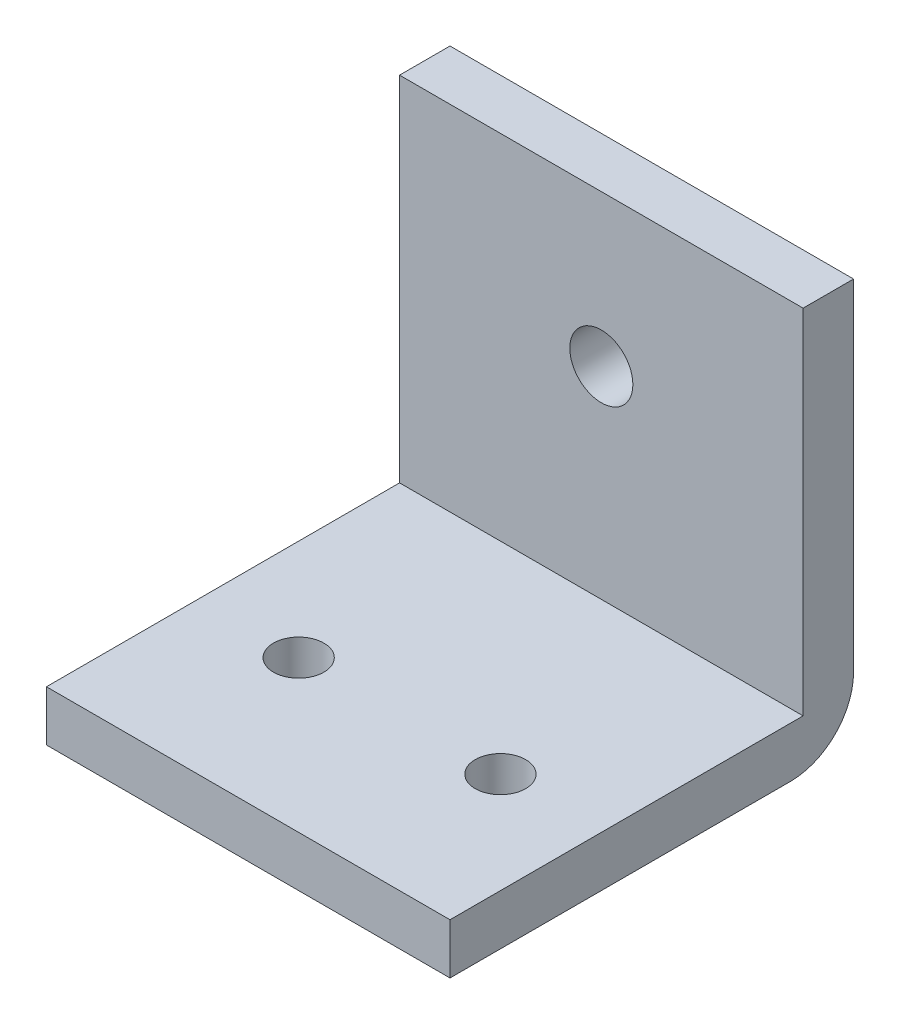
ISO-10303-21;
HEADER;
FILE_DESCRIPTION(('STEP AP214'),'2;1');
FILE_NAME('part.step','',(''),(''),'','','');
FILE_SCHEMA(('AUTOMOTIVE_DESIGN { 1 0 10303 214 1 1 1 1 }'));
ENDSEC;
DATA;
#1=APPLICATION_CONTEXT('core data for automotive mechanical design processes');
#2=APPLICATION_PROTOCOL_DEFINITION('international standard','automotive_design',2000,#1);
#3=PRODUCT_CONTEXT('',#1,'mechanical');
#4=PRODUCT('Part','Part','',(#3));
#5=PRODUCT_RELATED_PRODUCT_CATEGORY('part','',(#4));
#6=PRODUCT_DEFINITION_FORMATION('','',#4);
#7=PRODUCT_DEFINITION_CONTEXT('part definition',#1,'design');
#8=PRODUCT_DEFINITION('design','',#6,#7);
#9=PRODUCT_DEFINITION_SHAPE('','',#8);
#10=(LENGTH_UNIT() NAMED_UNIT(*) SI_UNIT(.MILLI.,.METRE.));
#11=(NAMED_UNIT(*) PLANE_ANGLE_UNIT() SI_UNIT($,.RADIAN.));
#12=(NAMED_UNIT(*) SI_UNIT($,.STERADIAN.) SOLID_ANGLE_UNIT());
#13=UNCERTAINTY_MEASURE_WITH_UNIT(LENGTH_MEASURE(1.E-05),#10,'distance_accuracy_value','');
#14=(GEOMETRIC_REPRESENTATION_CONTEXT(3) GLOBAL_UNCERTAINTY_ASSIGNED_CONTEXT((#13)) GLOBAL_UNIT_ASSIGNED_CONTEXT((#10,
#11,#12)) REPRESENTATION_CONTEXT('',''));
#15=CARTESIAN_POINT('',(0.,0.,0.));
#16=DIRECTION('',(0.,0.,1.));
#17=DIRECTION('',(1.,0.,0.));
#18=AXIS2_PLACEMENT_3D('',#15,#16,#17);
#19=CARTESIAN_POINT('',(40.,0.,5.));
#20=DIRECTION('',(-1.,0.,0.));
#21=DIRECTION('',(0.,0.,1.));
#22=AXIS2_PLACEMENT_3D('',#19,#20,#21);
#23=PLANE('',#22);
#24=DIRECTION('',(0.,0.,-1.));
#25=VECTOR('',#24,1.);
#26=CARTESIAN_POINT('',(40.,0.,40.));
#27=LINE('',#26,#25);
#28=CARTESIAN_POINT('',(40.,0.,40.));
#29=VERTEX_POINT('',#28);
#30=CARTESIAN_POINT('',(40.,0.,6.25));
#31=VERTEX_POINT('',#30);
#32=EDGE_CURVE('E126',#29,#31,#27,.T.);
#33=ORIENTED_EDGE('',*,*,#32,.T.);
#34=CARTESIAN_POINT('',(40.,6.25,6.25));
#35=DIRECTION('',(-1.,0.,0.));
#36=DIRECTION('',(0.,0.,1.));
#37=AXIS2_PLACEMENT_3D('',#34,#35,#36);
#38=CIRCLE('',#37,6.25);
#39=CARTESIAN_POINT('',(40.,6.25,0.));
#40=VERTEX_POINT('',#39);
#41=EDGE_CURVE('E58',#31,#40,#38,.F.);
#42=ORIENTED_EDGE('',*,*,#41,.T.);
#43=DIRECTION('',(0.,1.,0.));
#44=VECTOR('',#43,1.);
#45=CARTESIAN_POINT('',(40.,0.,0.));
#46=LINE('',#45,#44);
#47=CARTESIAN_POINT('',(40.,40.,0.));
#48=VERTEX_POINT('',#47);
#49=EDGE_CURVE('E103',#40,#48,#46,.T.);
#50=ORIENTED_EDGE('',*,*,#49,.T.);
#51=DIRECTION('',(0.,0.,-1.));
#52=VECTOR('',#51,1.);
#53=CARTESIAN_POINT('',(40.,40.,5.));
#54=LINE('',#53,#52);
#55=CARTESIAN_POINT('',(40.,40.,5.));
#56=VERTEX_POINT('',#55);
#57=EDGE_CURVE('E152',#56,#48,#54,.T.);
#58=ORIENTED_EDGE('',*,*,#57,.F.);
#59=DIRECTION('',(0.,1.,0.));
#60=VECTOR('',#59,1.);
#61=CARTESIAN_POINT('',(40.,0.,5.));
#62=LINE('',#61,#60);
#63=CARTESIAN_POINT('',(40.,5.,5.));
#64=VERTEX_POINT('',#63);
#65=EDGE_CURVE('E129',#64,#56,#62,.T.);
#66=ORIENTED_EDGE('',*,*,#65,.F.);
#67=DIRECTION('',(0.,0.,-1.));
#68=VECTOR('',#67,1.);
#69=CARTESIAN_POINT('',(40.,5.,40.));
#70=LINE('',#69,#68);
#71=CARTESIAN_POINT('',(40.,5.,40.));
#72=VERTEX_POINT('',#71);
#73=EDGE_CURVE('E124',#72,#64,#70,.T.);
#74=ORIENTED_EDGE('',*,*,#73,.F.);
#75=DIRECTION('',(0.,1.,0.));
#76=VECTOR('',#75,1.);
#77=CARTESIAN_POINT('',(40.,0.,40.));
#78=LINE('',#77,#76);
#79=EDGE_CURVE('E111',#29,#72,#78,.T.);
#80=ORIENTED_EDGE('',*,*,#79,.F.);
#81=EDGE_LOOP('',(#33,#42,#50,#58,#66,#74,#80));
#82=FACE_BOUND('',#81,.T.);
#83=ADVANCED_FACE('F36',(#82),#23,.F.);
#84=CARTESIAN_POINT('',(0.,40.,5.));
#85=DIRECTION('',(0.,1.,0.));
#86=DIRECTION('',(0.,0.,1.));
#87=AXIS2_PLACEMENT_3D('',#84,#85,#86);
#88=PLANE('',#87);
#89=DIRECTION('',(1.,0.,0.));
#90=VECTOR('',#89,1.);
#91=CARTESIAN_POINT('',(0.,40.,0.));
#92=LINE('',#91,#90);
#93=CARTESIAN_POINT('',(0.,40.,0.));
#94=VERTEX_POINT('',#93);
#95=EDGE_CURVE('E143',#94,#48,#92,.T.);
#96=ORIENTED_EDGE('',*,*,#95,.F.);
#97=DIRECTION('',(0.,0.,-1.));
#98=VECTOR('',#97,1.);
#99=CARTESIAN_POINT('',(0.,40.,5.));
#100=LINE('',#99,#98);
#101=CARTESIAN_POINT('',(0.,40.,5.));
#102=VERTEX_POINT('',#101);
#103=EDGE_CURVE('E141',#102,#94,#100,.T.);
#104=ORIENTED_EDGE('',*,*,#103,.F.);
#105=DIRECTION('',(1.,0.,0.));
#106=VECTOR('',#105,1.);
#107=CARTESIAN_POINT('',(0.,40.,5.));
#108=LINE('',#107,#106);
#109=EDGE_CURVE('E131',#102,#56,#108,.T.);
#110=ORIENTED_EDGE('',*,*,#109,.T.);
#111=ORIENTED_EDGE('',*,*,#57,.T.);
#112=EDGE_LOOP('',(#96,#104,#110,#111));
#113=FACE_BOUND('',#112,.T.);
#114=ADVANCED_FACE('F172',(#113),#88,.T.);
#115=CARTESIAN_POINT('',(0.,0.,5.));
#116=DIRECTION('',(-1.,0.,0.));
#117=DIRECTION('',(0.,0.,1.));
#118=AXIS2_PLACEMENT_3D('',#115,#116,#117);
#119=PLANE('',#118);
#120=DIRECTION('',(0.,1.,0.));
#121=VECTOR('',#120,1.);
#122=CARTESIAN_POINT('',(0.,0.,0.));
#123=LINE('',#122,#121);
#124=CARTESIAN_POINT('',(0.,6.25,0.));
#125=VERTEX_POINT('',#124);
#126=EDGE_CURVE('E146',#125,#94,#123,.T.);
#127=ORIENTED_EDGE('',*,*,#126,.F.);
#128=CARTESIAN_POINT('',(0.,6.25,6.25));
#129=DIRECTION('',(-1.,0.,0.));
#130=DIRECTION('',(0.,0.,1.));
#131=AXIS2_PLACEMENT_3D('',#128,#129,#130);
#132=CIRCLE('',#131,6.25);
#133=CARTESIAN_POINT('',(0.,0.,6.25));
#134=VERTEX_POINT('',#133);
#135=EDGE_CURVE('E11',#125,#134,#132,.T.);
#136=ORIENTED_EDGE('',*,*,#135,.T.);
#137=DIRECTION('',(0.,0.,-1.));
#138=VECTOR('',#137,1.);
#139=CARTESIAN_POINT('',(0.,0.,40.));
#140=LINE('',#139,#138);
#141=CARTESIAN_POINT('',(0.,0.,40.));
#142=VERTEX_POINT('',#141);
#143=EDGE_CURVE('E104',#142,#134,#140,.T.);
#144=ORIENTED_EDGE('',*,*,#143,.F.);
#145=DIRECTION('',(0.,1.,0.));
#146=VECTOR('',#145,1.);
#147=CARTESIAN_POINT('',(0.,0.,40.));
#148=LINE('',#147,#146);
#149=CARTESIAN_POINT('',(0.,5.,40.));
#150=VERTEX_POINT('',#149);
#151=EDGE_CURVE('E109',#142,#150,#148,.T.);
#152=ORIENTED_EDGE('',*,*,#151,.T.);
#153=DIRECTION('',(0.,0.,-1.));
#154=VECTOR('',#153,1.);
#155=CARTESIAN_POINT('',(0.,5.,40.));
#156=LINE('',#155,#154);
#157=CARTESIAN_POINT('',(0.,5.,5.));
#158=VERTEX_POINT('',#157);
#159=EDGE_CURVE('E93',#150,#158,#156,.T.);
#160=ORIENTED_EDGE('',*,*,#159,.T.);
#161=DIRECTION('',(0.,1.,0.));
#162=VECTOR('',#161,1.);
#163=CARTESIAN_POINT('',(0.,0.,5.));
#164=LINE('',#163,#162);
#165=EDGE_CURVE('E135',#158,#102,#164,.T.);
#166=ORIENTED_EDGE('',*,*,#165,.T.);
#167=ORIENTED_EDGE('',*,*,#103,.T.);
#168=EDGE_LOOP('',(#127,#136,#144,#152,#160,#166,#167));
#169=FACE_BOUND('',#168,.T.);
#170=ADVANCED_FACE('F115',(#169),#119,.T.);
#171=CARTESIAN_POINT('',(20.,25.,5.));
#172=DIRECTION('',(0.,0.,-1.));
#173=DIRECTION('',(-1.,0.,0.));
#174=AXIS2_PLACEMENT_3D('',#171,#172,#173);
#175=CYLINDRICAL_SURFACE('',#174,3.125);
#176=CARTESIAN_POINT('',(20.,25.,5.));
#177=DIRECTION('',(0.,0.,1.));
#178=DIRECTION('',(1.,0.,0.));
#179=AXIS2_PLACEMENT_3D('',#176,#177,#178);
#180=CIRCLE('',#179,3.125);
#181=CARTESIAN_POINT('',(23.125,25.,5.));
#182=VERTEX_POINT('',#181);
#183=EDGE_CURVE('E138',#182,#182,#180,.T.);
#184=ORIENTED_EDGE('',*,*,#183,.T.);
#185=EDGE_LOOP('',(#184));
#186=FACE_BOUND('',#185,.T.);
#187=CARTESIAN_POINT('',(20.,25.,0.));
#188=DIRECTION('',(0.,0.,1.));
#189=DIRECTION('',(1.,0.,0.));
#190=AXIS2_PLACEMENT_3D('',#187,#188,#189);
#191=CIRCLE('',#190,3.125);
#192=CARTESIAN_POINT('',(23.125,25.,0.));
#193=VERTEX_POINT('',#192);
#194=EDGE_CURVE('E132',#193,#193,#191,.T.);
#195=ORIENTED_EDGE('',*,*,#194,.F.);
#196=EDGE_LOOP('',(#195));
#197=FACE_BOUND('',#196,.T.);
#198=ADVANCED_FACE('F193',(#186,#197),#175,.F.);
#199=CARTESIAN_POINT('',(0.,0.,5.));
#200=DIRECTION('',(0.,0.,1.));
#201=DIRECTION('',(1.,0.,0.));
#202=AXIS2_PLACEMENT_3D('',#199,#200,#201);
#203=PLANE('',#202);
#204=ORIENTED_EDGE('',*,*,#65,.T.);
#205=ORIENTED_EDGE('',*,*,#109,.F.);
#206=ORIENTED_EDGE('',*,*,#165,.F.);
#207=DIRECTION('',(1.,0.,0.));
#208=VECTOR('',#207,1.);
#209=CARTESIAN_POINT('',(0.,5.,5.));
#210=LINE('',#209,#208);
#211=EDGE_CURVE('E98',#158,#64,#210,.T.);
#212=ORIENTED_EDGE('',*,*,#211,.T.);
#213=EDGE_LOOP('',(#204,#205,#206,#212));
#214=FACE_BOUND('',#213,.T.);
#215=ORIENTED_EDGE('',*,*,#183,.F.);
#216=EDGE_LOOP('',(#215));
#217=FACE_BOUND('',#216,.T.);
#218=ADVANCED_FACE('F167',(#214,#217),#203,.T.);
#219=CARTESIAN_POINT('',(0.,0.,0.));
#220=DIRECTION('',(0.,0.,1.));
#221=DIRECTION('',(1.,0.,0.));
#222=AXIS2_PLACEMENT_3D('',#219,#220,#221);
#223=PLANE('',#222);
#224=ORIENTED_EDGE('',*,*,#49,.F.);
#225=DIRECTION('',(1.,0.,0.));
#226=VECTOR('',#225,1.);
#227=CARTESIAN_POINT('',(0.,6.25,0.));
#228=LINE('',#227,#226);
#229=EDGE_CURVE('E44',#40,#125,#228,.F.);
#230=ORIENTED_EDGE('',*,*,#229,.T.);
#231=ORIENTED_EDGE('',*,*,#126,.T.);
#232=ORIENTED_EDGE('',*,*,#95,.T.);
#233=EDGE_LOOP('',(#224,#230,#231,#232));
#234=FACE_BOUND('',#233,.T.);
#235=ORIENTED_EDGE('',*,*,#194,.T.);
#236=EDGE_LOOP('',(#235));
#237=FACE_BOUND('',#236,.T.);
#238=ADVANCED_FACE('F173',(#234,#237),#223,.F.);
#239=CARTESIAN_POINT('',(0.,5.,40.));
#240=DIRECTION('',(0.,1.,0.));
#241=DIRECTION('',(0.,0.,1.));
#242=AXIS2_PLACEMENT_3D('',#239,#240,#241);
#243=PLANE('',#242);
#244=CARTESIAN_POINT('',(10.,5.,25.));
#245=DIRECTION('',(0.,1.,0.));
#246=DIRECTION('',(0.,0.,1.));
#247=AXIS2_PLACEMENT_3D('',#244,#245,#246);
#248=CIRCLE('',#247,2.5);
#249=CARTESIAN_POINT('',(10.,5.,27.5));
#250=VERTEX_POINT('',#249);
#251=EDGE_CURVE('E216',#250,#250,#248,.T.);
#252=ORIENTED_EDGE('',*,*,#251,.F.);
#253=EDGE_LOOP('',(#252));
#254=FACE_BOUND('',#253,.T.);
#255=CARTESIAN_POINT('',(30.,5.,25.));
#256=DIRECTION('',(0.,1.,0.));
#257=DIRECTION('',(0.,0.,-1.));
#258=AXIS2_PLACEMENT_3D('',#255,#256,#257);
#259=CIRCLE('',#258,2.5);
#260=CARTESIAN_POINT('',(30.,5.,22.5));
#261=VERTEX_POINT('',#260);
#262=EDGE_CURVE('E221',#261,#261,#259,.T.);
#263=ORIENTED_EDGE('',*,*,#262,.F.);
#264=EDGE_LOOP('',(#263));
#265=FACE_BOUND('',#264,.T.);
#266=ORIENTED_EDGE('',*,*,#211,.F.);
#267=ORIENTED_EDGE('',*,*,#159,.F.);
#268=DIRECTION('',(1.,0.,0.));
#269=VECTOR('',#268,1.);
#270=CARTESIAN_POINT('',(0.,5.,40.));
#271=LINE('',#270,#269);
#272=EDGE_CURVE('E96',#150,#72,#271,.T.);
#273=ORIENTED_EDGE('',*,*,#272,.T.);
#274=ORIENTED_EDGE('',*,*,#73,.T.);
#275=EDGE_LOOP('',(#266,#267,#273,#274));
#276=FACE_BOUND('',#275,.T.);
#277=ADVANCED_FACE('F95',(#254,#265,#276),#243,.T.);
#278=CARTESIAN_POINT('',(0.,0.,40.));
#279=DIRECTION('',(0.,1.,0.));
#280=DIRECTION('',(0.,0.,1.));
#281=AXIS2_PLACEMENT_3D('',#278,#279,#280);
#282=PLANE('',#281);
#283=CARTESIAN_POINT('',(10.,0.,25.));
#284=DIRECTION('',(0.,1.,0.));
#285=DIRECTION('',(0.,0.,1.));
#286=AXIS2_PLACEMENT_3D('',#283,#284,#285);
#287=CIRCLE('',#286,2.5);
#288=CARTESIAN_POINT('',(10.,0.,27.5));
#289=VERTEX_POINT('',#288);
#290=EDGE_CURVE('E113',#289,#289,#287,.T.);
#291=ORIENTED_EDGE('',*,*,#290,.T.);
#292=EDGE_LOOP('',(#291));
#293=FACE_BOUND('',#292,.T.);
#294=CARTESIAN_POINT('',(30.,0.,25.));
#295=DIRECTION('',(0.,1.,0.));
#296=DIRECTION('',(0.,0.,-1.));
#297=AXIS2_PLACEMENT_3D('',#294,#295,#296);
#298=CIRCLE('',#297,2.5);
#299=CARTESIAN_POINT('',(30.,0.,22.5));
#300=VERTEX_POINT('',#299);
#301=EDGE_CURVE('E217',#300,#300,#298,.T.);
#302=ORIENTED_EDGE('',*,*,#301,.T.);
#303=EDGE_LOOP('',(#302));
#304=FACE_BOUND('',#303,.T.);
#305=ORIENTED_EDGE('',*,*,#143,.T.);
#306=DIRECTION('',(1.,0.,0.));
#307=VECTOR('',#306,1.);
#308=CARTESIAN_POINT('',(0.,0.,6.25));
#309=LINE('',#308,#307);
#310=EDGE_CURVE('E155',#134,#31,#309,.T.);
#311=ORIENTED_EDGE('',*,*,#310,.T.);
#312=ORIENTED_EDGE('',*,*,#32,.F.);
#313=DIRECTION('',(1.,0.,0.));
#314=VECTOR('',#313,1.);
#315=CARTESIAN_POINT('',(0.,0.,40.));
#316=LINE('',#315,#314);
#317=EDGE_CURVE('E118',#142,#29,#316,.T.);
#318=ORIENTED_EDGE('',*,*,#317,.F.);
#319=EDGE_LOOP('',(#305,#311,#312,#318));
#320=FACE_BOUND('',#319,.T.);
#321=ADVANCED_FACE('F161',(#293,#304,#320),#282,.F.);
#322=CARTESIAN_POINT('',(0.,0.,40.));
#323=DIRECTION('',(0.,0.,1.));
#324=DIRECTION('',(1.,0.,0.));
#325=AXIS2_PLACEMENT_3D('',#322,#323,#324);
#326=PLANE('',#325);
#327=ORIENTED_EDGE('',*,*,#272,.F.);
#328=ORIENTED_EDGE('',*,*,#151,.F.);
#329=ORIENTED_EDGE('',*,*,#317,.T.);
#330=ORIENTED_EDGE('',*,*,#79,.T.);
#331=EDGE_LOOP('',(#327,#328,#329,#330));
#332=FACE_BOUND('',#331,.T.);
#333=ADVANCED_FACE('F108',(#332),#326,.T.);
#334=CARTESIAN_POINT('',(0.,6.25,6.25));
#335=DIRECTION('',(1.,0.,0.));
#336=DIRECTION('',(0.,0.,-1.));
#337=AXIS2_PLACEMENT_3D('',#334,#335,#336);
#338=CYLINDRICAL_SURFACE('',#337,6.25);
#339=ORIENTED_EDGE('',*,*,#135,.F.);
#340=ORIENTED_EDGE('',*,*,#229,.F.);
#341=ORIENTED_EDGE('',*,*,#41,.F.);
#342=ORIENTED_EDGE('',*,*,#310,.F.);
#343=EDGE_LOOP('',(#339,#340,#341,#342));
#344=FACE_BOUND('',#343,.T.);
#345=ADVANCED_FACE('F38',(#344),#338,.T.);
#346=CARTESIAN_POINT('',(30.,0.,25.));
#347=DIRECTION('',(0.,1.,0.));
#348=DIRECTION('',(0.,0.,1.));
#349=AXIS2_PLACEMENT_3D('',#346,#347,#348);
#350=CYLINDRICAL_SURFACE('',#349,2.5);
#351=ORIENTED_EDGE('',*,*,#301,.F.);
#352=EDGE_LOOP('',(#351));
#353=FACE_BOUND('',#352,.T.);
#354=ORIENTED_EDGE('',*,*,#262,.T.);
#355=EDGE_LOOP('',(#354));
#356=FACE_BOUND('',#355,.T.);
#357=ADVANCED_FACE('F176',(#353,#356),#350,.F.);
#358=CARTESIAN_POINT('',(10.,0.,25.));
#359=DIRECTION('',(0.,1.,0.));
#360=DIRECTION('',(0.,0.,1.));
#361=AXIS2_PLACEMENT_3D('',#358,#359,#360);
#362=CYLINDRICAL_SURFACE('',#361,2.5);
#363=ORIENTED_EDGE('',*,*,#290,.F.);
#364=EDGE_LOOP('',(#363));
#365=FACE_BOUND('',#364,.T.);
#366=ORIENTED_EDGE('',*,*,#251,.T.);
#367=EDGE_LOOP('',(#366));
#368=FACE_BOUND('',#367,.T.);
#369=ADVANCED_FACE('F181',(#365,#368),#362,.F.);
#370=CLOSED_SHELL('',(#83,#114,#170,#198,#218,#238,#277,#321,#333,#345,#357,#369));
#371=MANIFOLD_SOLID_BREP('B2',#370);
#372=ADVANCED_BREP_SHAPE_REPRESENTATION('',(#18,#371),#14);
#373=SHAPE_DEFINITION_REPRESENTATION(#9,#372);
ENDSEC;
END-ISO-10303-21;
